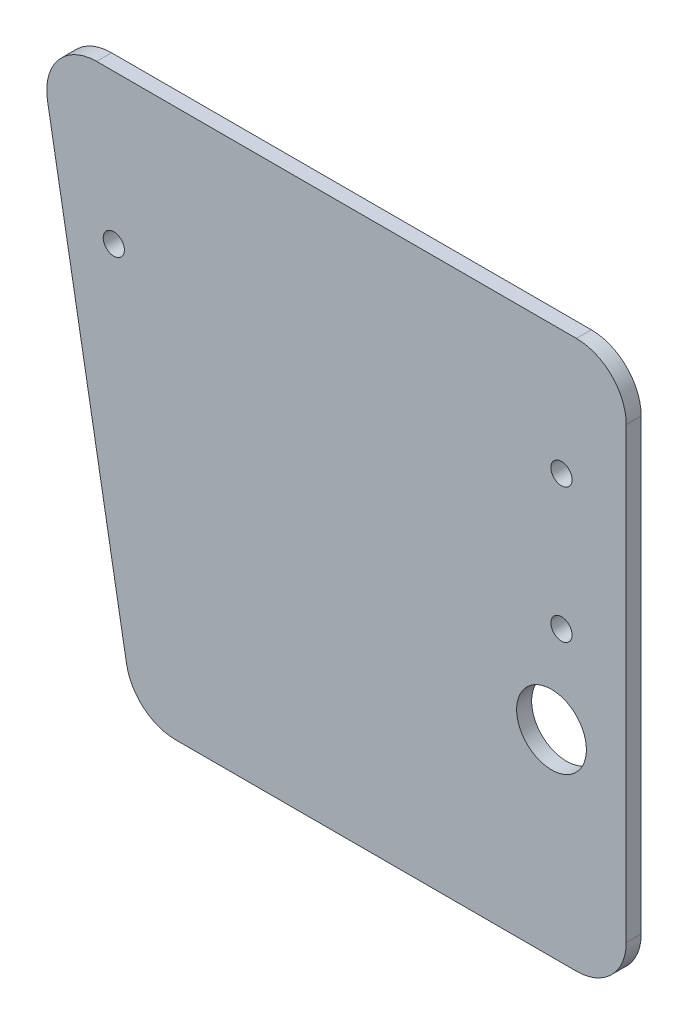
ISO-10303-21;
HEADER;
FILE_DESCRIPTION(('STEP AP214'),'2;1');
FILE_NAME('part.step','',(''),(''),'','','');
FILE_SCHEMA(('AUTOMOTIVE_DESIGN { 1 0 10303 214 1 1 1 1 }'));
ENDSEC;
DATA;
#1=APPLICATION_CONTEXT('core data for automotive mechanical design processes');
#2=APPLICATION_PROTOCOL_DEFINITION('international standard','automotive_design',2000,#1);
#3=PRODUCT_CONTEXT('',#1,'mechanical');
#4=PRODUCT('Part','Part','',(#3));
#5=PRODUCT_RELATED_PRODUCT_CATEGORY('part','',(#4));
#6=PRODUCT_DEFINITION_FORMATION('','',#4);
#7=PRODUCT_DEFINITION_CONTEXT('part definition',#1,'design');
#8=PRODUCT_DEFINITION('design','',#6,#7);
#9=PRODUCT_DEFINITION_SHAPE('','',#8);
#10=(LENGTH_UNIT() NAMED_UNIT(*) SI_UNIT(.MILLI.,.METRE.));
#11=(NAMED_UNIT(*) PLANE_ANGLE_UNIT() SI_UNIT($,.RADIAN.));
#12=(NAMED_UNIT(*) SI_UNIT($,.STERADIAN.) SOLID_ANGLE_UNIT());
#13=UNCERTAINTY_MEASURE_WITH_UNIT(LENGTH_MEASURE(1.E-05),#10,'distance_accuracy_value','');
#14=(GEOMETRIC_REPRESENTATION_CONTEXT(3) GLOBAL_UNCERTAINTY_ASSIGNED_CONTEXT((#13)) GLOBAL_UNIT_ASSIGNED_CONTEXT((#10,
#11,#12)) REPRESENTATION_CONTEXT('',''));
#15=CARTESIAN_POINT('',(0.,0.,0.));
#16=DIRECTION('',(0.,0.,1.));
#17=DIRECTION('',(1.,0.,0.));
#18=AXIS2_PLACEMENT_3D('',#15,#16,#17);
#19=CARTESIAN_POINT('',(19.3959678779315,-110.,3.));
#20=DIRECTION('',(0.984807753012208,0.173648177666934,0.));
#21=DIRECTION('',(-0.173648177666934,0.984807753012208,0.));
#22=AXIS2_PLACEMENT_3D('',#19,#20,#21);
#23=PLANE('',#22);
#24=DIRECTION('',(0.173648177666934,-0.984807753012207,0.));
#25=VECTOR('',#24,1.);
#26=CARTESIAN_POINT('',(19.3959678779315,-110.,0.));
#27=LINE('',#26,#25);
#28=CARTESIAN_POINT('',(2.06945839582006,-11.7364817766693,0.));
#29=VERTEX_POINT('',#28);
#30=CARTESIAN_POINT('',(17.9388866595822,-101.736481776669,0.));
#31=VERTEX_POINT('',#30);
#32=EDGE_CURVE('E164',#29,#31,#27,.T.);
#33=ORIENTED_EDGE('',*,*,#32,.T.);
#34=DIRECTION('',(0.,0.,-1.));
#35=VECTOR('',#34,1.);
#36=CARTESIAN_POINT('',(17.9388866595822,-101.736481776669,3.));
#37=LINE('',#36,#35);
#38=CARTESIAN_POINT('',(17.9388866595822,-101.736481776669,3.));
#39=VERTEX_POINT('',#38);
#40=EDGE_CURVE('E11',#31,#39,#37,.F.);
#41=ORIENTED_EDGE('',*,*,#40,.T.);
#42=DIRECTION('',(0.173648177666934,-0.984807753012207,0.));
#43=VECTOR('',#42,1.);
#44=CARTESIAN_POINT('',(19.3959678779315,-110.,3.));
#45=LINE('',#44,#43);
#46=CARTESIAN_POINT('',(2.06945839582006,-11.7364817766693,3.));
#47=VERTEX_POINT('',#46);
#48=EDGE_CURVE('E140',#47,#39,#45,.T.);
#49=ORIENTED_EDGE('',*,*,#48,.F.);
#50=DIRECTION('',(0.,0.,-1.));
#51=VECTOR('',#50,1.);
#52=CARTESIAN_POINT('',(2.06945839582007,-11.7364817766693,3.));
#53=LINE('',#52,#51);
#54=EDGE_CURVE('E53',#47,#29,#53,.T.);
#55=ORIENTED_EDGE('',*,*,#54,.T.);
#56=EDGE_LOOP('',(#33,#41,#49,#55));
#57=FACE_BOUND('',#56,.T.);
#58=ADVANCED_FACE('F44',(#57),#23,.F.);
#59=CARTESIAN_POINT('',(19.3959678779315,-110.,3.));
#60=DIRECTION('',(0.,1.,0.));
#61=DIRECTION('',(0.,0.,1.));
#62=AXIS2_PLACEMENT_3D('',#59,#60,#61);
#63=PLANE('',#62);
#64=DIRECTION('',(1.,0.,0.));
#65=VECTOR('',#64,1.);
#66=CARTESIAN_POINT('',(19.3959678779315,-110.,0.));
#67=LINE('',#66,#65);
#68=CARTESIAN_POINT('',(27.7869641897043,-110.,0.));
#69=VERTEX_POINT('',#68);
#70=CARTESIAN_POINT('',(108.235967877932,-110.,0.));
#71=VERTEX_POINT('',#70);
#72=EDGE_CURVE('E147',#69,#71,#67,.T.);
#73=ORIENTED_EDGE('',*,*,#72,.T.);
#74=DIRECTION('',(0.,0.,-1.));
#75=VECTOR('',#74,1.);
#76=CARTESIAN_POINT('',(108.235967877932,-110.,3.));
#77=LINE('',#76,#75);
#78=CARTESIAN_POINT('',(108.235967877932,-110.,3.));
#79=VERTEX_POINT('',#78);
#80=EDGE_CURVE('E60',#71,#79,#77,.F.);
#81=ORIENTED_EDGE('',*,*,#80,.T.);
#82=DIRECTION('',(1.,0.,0.));
#83=VECTOR('',#82,1.);
#84=CARTESIAN_POINT('',(19.3959678779315,-110.,3.));
#85=LINE('',#84,#83);
#86=CARTESIAN_POINT('',(27.7869641897043,-110.,3.));
#87=VERTEX_POINT('',#86);
#88=EDGE_CURVE('E145',#87,#79,#85,.T.);
#89=ORIENTED_EDGE('',*,*,#88,.F.);
#90=DIRECTION('',(0.,0.,-1.));
#91=VECTOR('',#90,1.);
#92=CARTESIAN_POINT('',(27.7869641897043,-110.,3.));
#93=LINE('',#92,#91);
#94=EDGE_CURVE('E190',#87,#69,#93,.T.);
#95=ORIENTED_EDGE('',*,*,#94,.T.);
#96=EDGE_LOOP('',(#73,#81,#89,#95));
#97=FACE_BOUND('',#96,.T.);
#98=ADVANCED_FACE('F256',(#97),#63,.F.);
#99=CARTESIAN_POINT('',(118.235967877932,-110.,3.));
#100=DIRECTION('',(-1.,0.,0.));
#101=DIRECTION('',(0.,0.,1.));
#102=AXIS2_PLACEMENT_3D('',#99,#100,#101);
#103=PLANE('',#102);
#104=DIRECTION('',(0.,1.,0.));
#105=VECTOR('',#104,1.);
#106=CARTESIAN_POINT('',(118.235967877932,-110.,0.));
#107=LINE('',#106,#105);
#108=CARTESIAN_POINT('',(118.235967877932,-100.,0.));
#109=VERTEX_POINT('',#108);
#110=CARTESIAN_POINT('',(118.235967877932,-9.99999999999999,0.));
#111=VERTEX_POINT('',#110);
#112=EDGE_CURVE('E141',#109,#111,#107,.T.);
#113=ORIENTED_EDGE('',*,*,#112,.T.);
#114=DIRECTION('',(0.,0.,-1.));
#115=VECTOR('',#114,1.);
#116=CARTESIAN_POINT('',(118.235967877932,-9.99999999999999,3.));
#117=LINE('',#116,#115);
#118=CARTESIAN_POINT('',(118.235967877932,-9.99999999999999,3.));
#119=VERTEX_POINT('',#118);
#120=EDGE_CURVE('E116',#111,#119,#117,.F.);
#121=ORIENTED_EDGE('',*,*,#120,.T.);
#122=DIRECTION('',(0.,1.,0.));
#123=VECTOR('',#122,1.);
#124=CARTESIAN_POINT('',(118.235967877932,-110.,3.));
#125=LINE('',#124,#123);
#126=CARTESIAN_POINT('',(118.235967877932,-100.,3.));
#127=VERTEX_POINT('',#126);
#128=EDGE_CURVE('E211',#127,#119,#125,.T.);
#129=ORIENTED_EDGE('',*,*,#128,.F.);
#130=DIRECTION('',(0.,0.,-1.));
#131=VECTOR('',#130,1.);
#132=CARTESIAN_POINT('',(118.235967877932,-100.,3.));
#133=LINE('',#132,#131);
#134=EDGE_CURVE('E122',#127,#109,#133,.T.);
#135=ORIENTED_EDGE('',*,*,#134,.T.);
#136=EDGE_LOOP('',(#113,#121,#129,#135));
#137=FACE_BOUND('',#136,.T.);
#138=ADVANCED_FACE('F253',(#137),#103,.F.);
#139=CARTESIAN_POINT('',(0.,0.,3.));
#140=DIRECTION('',(0.,-1.,0.));
#141=DIRECTION('',(0.,0.,-1.));
#142=AXIS2_PLACEMENT_3D('',#139,#140,#141);
#143=PLANE('',#142);
#144=DIRECTION('',(-1.,0.,0.));
#145=VECTOR('',#144,1.);
#146=CARTESIAN_POINT('',(0.,0.,3.));
#147=LINE('',#146,#145);
#148=CARTESIAN_POINT('',(108.235967877932,0.,3.));
#149=VERTEX_POINT('',#148);
#150=CARTESIAN_POINT('',(11.9175359259421,0.,3.));
#151=VERTEX_POINT('',#150);
#152=EDGE_CURVE('E132',#149,#151,#147,.T.);
#153=ORIENTED_EDGE('',*,*,#152,.F.);
#154=DIRECTION('',(0.,0.,-1.));
#155=VECTOR('',#154,1.);
#156=CARTESIAN_POINT('',(108.235967877932,0.,3.));
#157=LINE('',#156,#155);
#158=CARTESIAN_POINT('',(108.235967877932,0.,0.));
#159=VERTEX_POINT('',#158);
#160=EDGE_CURVE('E115',#149,#159,#157,.T.);
#161=ORIENTED_EDGE('',*,*,#160,.T.);
#162=DIRECTION('',(-1.,0.,0.));
#163=VECTOR('',#162,1.);
#164=CARTESIAN_POINT('',(0.,0.,0.));
#165=LINE('',#164,#163);
#166=CARTESIAN_POINT('',(11.9175359259421,0.,0.));
#167=VERTEX_POINT('',#166);
#168=EDGE_CURVE('E129',#159,#167,#165,.T.);
#169=ORIENTED_EDGE('',*,*,#168,.T.);
#170=DIRECTION('',(0.,0.,-1.));
#171=VECTOR('',#170,1.);
#172=CARTESIAN_POINT('',(11.9175359259421,0.,3.));
#173=LINE('',#172,#171);
#174=EDGE_CURVE('E135',#167,#151,#173,.F.);
#175=ORIENTED_EDGE('',*,*,#174,.T.);
#176=EDGE_LOOP('',(#153,#161,#169,#175));
#177=FACE_BOUND('',#176,.T.);
#178=ADVANCED_FACE('F128',(#177),#143,.F.);
#179=CARTESIAN_POINT('',(0.,0.,3.));
#180=DIRECTION('',(0.,0.,-1.));
#181=DIRECTION('',(-1.,0.,0.));
#182=AXIS2_PLACEMENT_3D('',#179,#180,#181);
#183=PLANE('',#182);
#184=CARTESIAN_POINT('',(105.235967877932,-52.,3.));
#185=DIRECTION('',(0.,0.,1.));
#186=DIRECTION('',(1.,0.,0.));
#187=AXIS2_PLACEMENT_3D('',#184,#185,#186);
#188=CIRCLE('',#187,2.125);
#189=CARTESIAN_POINT('',(107.360967877932,-52.,3.));
#190=VERTEX_POINT('',#189);
#191=EDGE_CURVE('E232',#190,#190,#188,.T.);
#192=ORIENTED_EDGE('',*,*,#191,.F.);
#193=EDGE_LOOP('',(#192));
#194=FACE_BOUND('',#193,.T.);
#195=CARTESIAN_POINT('',(105.235967877932,-25.,3.));
#196=DIRECTION('',(0.,0.,1.));
#197=DIRECTION('',(1.,0.,0.));
#198=AXIS2_PLACEMENT_3D('',#195,#196,#197);
#199=CIRCLE('',#198,2.125);
#200=CARTESIAN_POINT('',(107.360967877932,-25.,3.));
#201=VERTEX_POINT('',#200);
#202=EDGE_CURVE('E156',#201,#201,#199,.T.);
#203=ORIENTED_EDGE('',*,*,#202,.F.);
#204=EDGE_LOOP('',(#203));
#205=FACE_BOUND('',#204,.T.);
#206=CARTESIAN_POINT('',(15.3749640998744,-30.,3.));
#207=DIRECTION('',(0.,0.,1.));
#208=DIRECTION('',(1.,0.,0.));
#209=AXIS2_PLACEMENT_3D('',#206,#207,#208);
#210=CIRCLE('',#209,2.125);
#211=CARTESIAN_POINT('',(17.4999640998744,-30.,3.));
#212=VERTEX_POINT('',#211);
#213=EDGE_CURVE('E221',#212,#212,#210,.T.);
#214=ORIENTED_EDGE('',*,*,#213,.F.);
#215=EDGE_LOOP('',(#214));
#216=FACE_BOUND('',#215,.T.);
#217=CARTESIAN_POINT('',(103.235967877932,-70.5,3.));
#218=DIRECTION('',(0.,0.,1.));
#219=DIRECTION('',(1.,0.,0.));
#220=AXIS2_PLACEMENT_3D('',#217,#218,#219);
#221=CIRCLE('',#220,6.99999999999998);
#222=CARTESIAN_POINT('',(110.235967877932,-70.5,3.));
#223=VERTEX_POINT('',#222);
#224=EDGE_CURVE('E217',#223,#223,#221,.T.);
#225=ORIENTED_EDGE('',*,*,#224,.F.);
#226=EDGE_LOOP('',(#225));
#227=FACE_BOUND('',#226,.T.);
#228=ORIENTED_EDGE('',*,*,#128,.T.);
#229=CARTESIAN_POINT('',(108.235967877932,-10.,3.));
#230=DIRECTION('',(0.,0.,-1.));
#231=DIRECTION('',(-1.,0.,0.));
#232=AXIS2_PLACEMENT_3D('',#229,#230,#231);
#233=CIRCLE('',#232,10.);
#234=EDGE_CURVE('E187',#119,#149,#233,.F.);
#235=ORIENTED_EDGE('',*,*,#234,.T.);
#236=ORIENTED_EDGE('',*,*,#152,.T.);
#237=CARTESIAN_POINT('',(11.9175359259421,-9.99999999999999,3.));
#238=DIRECTION('',(0.,0.,-1.));
#239=DIRECTION('',(-1.,0.,0.));
#240=AXIS2_PLACEMENT_3D('',#237,#238,#239);
#241=CIRCLE('',#240,10.);
#242=EDGE_CURVE('E179',#151,#47,#241,.F.);
#243=ORIENTED_EDGE('',*,*,#242,.T.);
#244=ORIENTED_EDGE('',*,*,#48,.T.);
#245=CARTESIAN_POINT('',(27.7869641897043,-100.,3.));
#246=DIRECTION('',(0.,0.,-1.));
#247=DIRECTION('',(-1.,0.,0.));
#248=AXIS2_PLACEMENT_3D('',#245,#246,#247);
#249=CIRCLE('',#248,10.);
#250=EDGE_CURVE('E67',#39,#87,#249,.F.);
#251=ORIENTED_EDGE('',*,*,#250,.T.);
#252=ORIENTED_EDGE('',*,*,#88,.T.);
#253=CARTESIAN_POINT('',(108.235967877932,-100.,3.));
#254=DIRECTION('',(0.,0.,-1.));
#255=DIRECTION('',(-1.,0.,0.));
#256=AXIS2_PLACEMENT_3D('',#253,#254,#255);
#257=CIRCLE('',#256,10.);
#258=EDGE_CURVE('E184',#79,#127,#257,.F.);
#259=ORIENTED_EDGE('',*,*,#258,.T.);
#260=EDGE_LOOP('',(#228,#235,#236,#243,#244,#251,#252,#259));
#261=FACE_BOUND('',#260,.T.);
#262=ADVANCED_FACE('F240',(#194,#205,#216,#227,#261),#183,.F.);
#263=CARTESIAN_POINT('',(0.,0.,0.));
#264=DIRECTION('',(0.,0.,-1.));
#265=DIRECTION('',(-1.,0.,0.));
#266=AXIS2_PLACEMENT_3D('',#263,#264,#265);
#267=PLANE('',#266);
#268=CARTESIAN_POINT('',(105.235967877932,-52.,0.));
#269=DIRECTION('',(0.,0.,-1.));
#270=DIRECTION('',(-1.,0.,0.));
#271=AXIS2_PLACEMENT_3D('',#268,#269,#270);
#272=CIRCLE('',#271,2.125);
#273=CARTESIAN_POINT('',(103.110967877932,-52.,0.));
#274=VERTEX_POINT('',#273);
#275=EDGE_CURVE('E222',#274,#274,#272,.F.);
#276=ORIENTED_EDGE('',*,*,#275,.T.);
#277=EDGE_LOOP('',(#276));
#278=FACE_BOUND('',#277,.T.);
#279=CARTESIAN_POINT('',(105.235967877932,-25.,0.));
#280=DIRECTION('',(0.,0.,-1.));
#281=DIRECTION('',(-1.,0.,0.));
#282=AXIS2_PLACEMENT_3D('',#279,#280,#281);
#283=CIRCLE('',#282,2.125);
#284=CARTESIAN_POINT('',(103.110967877932,-25.,0.));
#285=VERTEX_POINT('',#284);
#286=EDGE_CURVE('E160',#285,#285,#283,.T.);
#287=ORIENTED_EDGE('',*,*,#286,.F.);
#288=EDGE_LOOP('',(#287));
#289=FACE_BOUND('',#288,.T.);
#290=CARTESIAN_POINT('',(15.3749640998744,-30.,0.));
#291=DIRECTION('',(0.,0.,-1.));
#292=DIRECTION('',(-1.,0.,0.));
#293=AXIS2_PLACEMENT_3D('',#290,#291,#292);
#294=CIRCLE('',#293,2.125);
#295=CARTESIAN_POINT('',(13.2499640998744,-30.,0.));
#296=VERTEX_POINT('',#295);
#297=EDGE_CURVE('E155',#296,#296,#294,.T.);
#298=ORIENTED_EDGE('',*,*,#297,.F.);
#299=EDGE_LOOP('',(#298));
#300=FACE_BOUND('',#299,.T.);
#301=CARTESIAN_POINT('',(103.235967877932,-70.5,0.));
#302=DIRECTION('',(0.,0.,-1.));
#303=DIRECTION('',(-1.,0.,0.));
#304=AXIS2_PLACEMENT_3D('',#301,#302,#303);
#305=CIRCLE('',#304,6.99999999999998);
#306=CARTESIAN_POINT('',(96.2359678779316,-70.5,0.));
#307=VERTEX_POINT('',#306);
#308=EDGE_CURVE('E151',#307,#307,#305,.T.);
#309=ORIENTED_EDGE('',*,*,#308,.F.);
#310=EDGE_LOOP('',(#309));
#311=FACE_BOUND('',#310,.T.);
#312=ORIENTED_EDGE('',*,*,#168,.F.);
#313=CARTESIAN_POINT('',(108.235967877932,-10.,0.));
#314=DIRECTION('',(0.,0.,-1.));
#315=DIRECTION('',(-1.,0.,0.));
#316=AXIS2_PLACEMENT_3D('',#313,#314,#315);
#317=CIRCLE('',#316,10.);
#318=EDGE_CURVE('E111',#159,#111,#317,.T.);
#319=ORIENTED_EDGE('',*,*,#318,.T.);
#320=ORIENTED_EDGE('',*,*,#112,.F.);
#321=CARTESIAN_POINT('',(108.235967877932,-100.,0.));
#322=DIRECTION('',(0.,0.,-1.));
#323=DIRECTION('',(-1.,0.,0.));
#324=AXIS2_PLACEMENT_3D('',#321,#322,#323);
#325=CIRCLE('',#324,10.);
#326=EDGE_CURVE('E123',#109,#71,#325,.T.);
#327=ORIENTED_EDGE('',*,*,#326,.T.);
#328=ORIENTED_EDGE('',*,*,#72,.F.);
#329=CARTESIAN_POINT('',(27.7869641897043,-100.,0.));
#330=DIRECTION('',(0.,0.,-1.));
#331=DIRECTION('',(-1.,0.,0.));
#332=AXIS2_PLACEMENT_3D('',#329,#330,#331);
#333=CIRCLE('',#332,10.);
#334=EDGE_CURVE('E169',#69,#31,#333,.T.);
#335=ORIENTED_EDGE('',*,*,#334,.T.);
#336=ORIENTED_EDGE('',*,*,#32,.F.);
#337=CARTESIAN_POINT('',(11.9175359259421,-9.99999999999999,0.));
#338=DIRECTION('',(0.,0.,-1.));
#339=DIRECTION('',(-1.,0.,0.));
#340=AXIS2_PLACEMENT_3D('',#337,#338,#339);
#341=CIRCLE('',#340,10.);
#342=EDGE_CURVE('E134',#29,#167,#341,.T.);
#343=ORIENTED_EDGE('',*,*,#342,.T.);
#344=EDGE_LOOP('',(#312,#319,#320,#327,#328,#335,#336,#343));
#345=FACE_BOUND('',#344,.T.);
#346=ADVANCED_FACE('F137',(#278,#289,#300,#311,#345),#267,.T.);
#347=CARTESIAN_POINT('',(103.235967877932,-70.5,-7.));
#348=DIRECTION('',(0.,0.,1.));
#349=DIRECTION('',(1.,0.,0.));
#350=AXIS2_PLACEMENT_3D('',#347,#348,#349);
#351=CYLINDRICAL_SURFACE('',#350,6.99999999999998);
#352=ORIENTED_EDGE('',*,*,#308,.T.);
#353=EDGE_LOOP('',(#352));
#354=FACE_BOUND('',#353,.T.);
#355=ORIENTED_EDGE('',*,*,#224,.T.);
#356=EDGE_LOOP('',(#355));
#357=FACE_BOUND('',#356,.T.);
#358=ADVANCED_FACE('F306',(#354,#357),#351,.F.);
#359=CARTESIAN_POINT('',(15.3749640998744,-30.,-7.));
#360=DIRECTION('',(0.,0.,1.));
#361=DIRECTION('',(1.,0.,0.));
#362=AXIS2_PLACEMENT_3D('',#359,#360,#361);
#363=CYLINDRICAL_SURFACE('',#362,2.125);
#364=ORIENTED_EDGE('',*,*,#297,.T.);
#365=EDGE_LOOP('',(#364));
#366=FACE_BOUND('',#365,.T.);
#367=ORIENTED_EDGE('',*,*,#213,.T.);
#368=EDGE_LOOP('',(#367));
#369=FACE_BOUND('',#368,.T.);
#370=ADVANCED_FACE('F346',(#366,#369),#363,.F.);
#371=CARTESIAN_POINT('',(105.235967877932,-25.,-7.));
#372=DIRECTION('',(0.,0.,1.));
#373=DIRECTION('',(1.,0.,0.));
#374=AXIS2_PLACEMENT_3D('',#371,#372,#373);
#375=CYLINDRICAL_SURFACE('',#374,2.125);
#376=ORIENTED_EDGE('',*,*,#286,.T.);
#377=EDGE_LOOP('',(#376));
#378=FACE_BOUND('',#377,.T.);
#379=ORIENTED_EDGE('',*,*,#202,.T.);
#380=EDGE_LOOP('',(#379));
#381=FACE_BOUND('',#380,.T.);
#382=ADVANCED_FACE('F277',(#378,#381),#375,.F.);
#383=CARTESIAN_POINT('',(108.235967877932,-10.,3.));
#384=DIRECTION('',(0.,0.,-1.));
#385=DIRECTION('',(-1.,0.,0.));
#386=AXIS2_PLACEMENT_3D('',#383,#384,#385);
#387=CYLINDRICAL_SURFACE('',#386,10.);
#388=ORIENTED_EDGE('',*,*,#234,.F.);
#389=ORIENTED_EDGE('',*,*,#120,.F.);
#390=ORIENTED_EDGE('',*,*,#318,.F.);
#391=ORIENTED_EDGE('',*,*,#160,.F.);
#392=EDGE_LOOP('',(#388,#389,#390,#391));
#393=FACE_BOUND('',#392,.T.);
#394=ADVANCED_FACE('F114',(#393),#387,.T.);
#395=CARTESIAN_POINT('',(108.235967877932,-100.,3.));
#396=DIRECTION('',(0.,0.,-1.));
#397=DIRECTION('',(-1.,0.,0.));
#398=AXIS2_PLACEMENT_3D('',#395,#396,#397);
#399=CYLINDRICAL_SURFACE('',#398,10.);
#400=ORIENTED_EDGE('',*,*,#258,.F.);
#401=ORIENTED_EDGE('',*,*,#80,.F.);
#402=ORIENTED_EDGE('',*,*,#326,.F.);
#403=ORIENTED_EDGE('',*,*,#134,.F.);
#404=EDGE_LOOP('',(#400,#401,#402,#403));
#405=FACE_BOUND('',#404,.T.);
#406=ADVANCED_FACE('F255',(#405),#399,.T.);
#407=CARTESIAN_POINT('',(27.7869641897043,-100.,3.));
#408=DIRECTION('',(0.,0.,-1.));
#409=DIRECTION('',(-1.,0.,0.));
#410=AXIS2_PLACEMENT_3D('',#407,#408,#409);
#411=CYLINDRICAL_SURFACE('',#410,10.);
#412=ORIENTED_EDGE('',*,*,#250,.F.);
#413=ORIENTED_EDGE('',*,*,#40,.F.);
#414=ORIENTED_EDGE('',*,*,#334,.F.);
#415=ORIENTED_EDGE('',*,*,#94,.F.);
#416=EDGE_LOOP('',(#412,#413,#414,#415));
#417=FACE_BOUND('',#416,.T.);
#418=ADVANCED_FACE('F259',(#417),#411,.T.);
#419=CARTESIAN_POINT('',(11.9175359259421,-9.99999999999999,3.));
#420=DIRECTION('',(0.,0.,-1.));
#421=DIRECTION('',(-1.,0.,0.));
#422=AXIS2_PLACEMENT_3D('',#419,#420,#421);
#423=CYLINDRICAL_SURFACE('',#422,10.);
#424=ORIENTED_EDGE('',*,*,#242,.F.);
#425=ORIENTED_EDGE('',*,*,#174,.F.);
#426=ORIENTED_EDGE('',*,*,#342,.F.);
#427=ORIENTED_EDGE('',*,*,#54,.F.);
#428=EDGE_LOOP('',(#424,#425,#426,#427));
#429=FACE_BOUND('',#428,.T.);
#430=ADVANCED_FACE('F46',(#429),#423,.T.);
#431=CARTESIAN_POINT('',(105.235967877932,-52.,-6.01040764008566));
#432=DIRECTION('',(0.,0.,1.));
#433=DIRECTION('',(1.,0.,0.));
#434=AXIS2_PLACEMENT_3D('',#431,#432,#433);
#435=CYLINDRICAL_SURFACE('',#434,2.125);
#436=ORIENTED_EDGE('',*,*,#191,.T.);
#437=EDGE_LOOP('',(#436));
#438=FACE_BOUND('',#437,.T.);
#439=ORIENTED_EDGE('',*,*,#275,.F.);
#440=EDGE_LOOP('',(#439));
#441=FACE_BOUND('',#440,.T.);
#442=ADVANCED_FACE('F237',(#438,#441),#435,.F.);
#443=CLOSED_SHELL('',(#58,#98,#138,#178,#262,#346,#358,#370,#382,#394,#406,#418,#430,#442));
#444=MANIFOLD_SOLID_BREP('B2',#443);
#445=ADVANCED_BREP_SHAPE_REPRESENTATION('',(#18,#444),#14);
#446=SHAPE_DEFINITION_REPRESENTATION(#9,#445);
ENDSEC;
END-ISO-10303-21;
